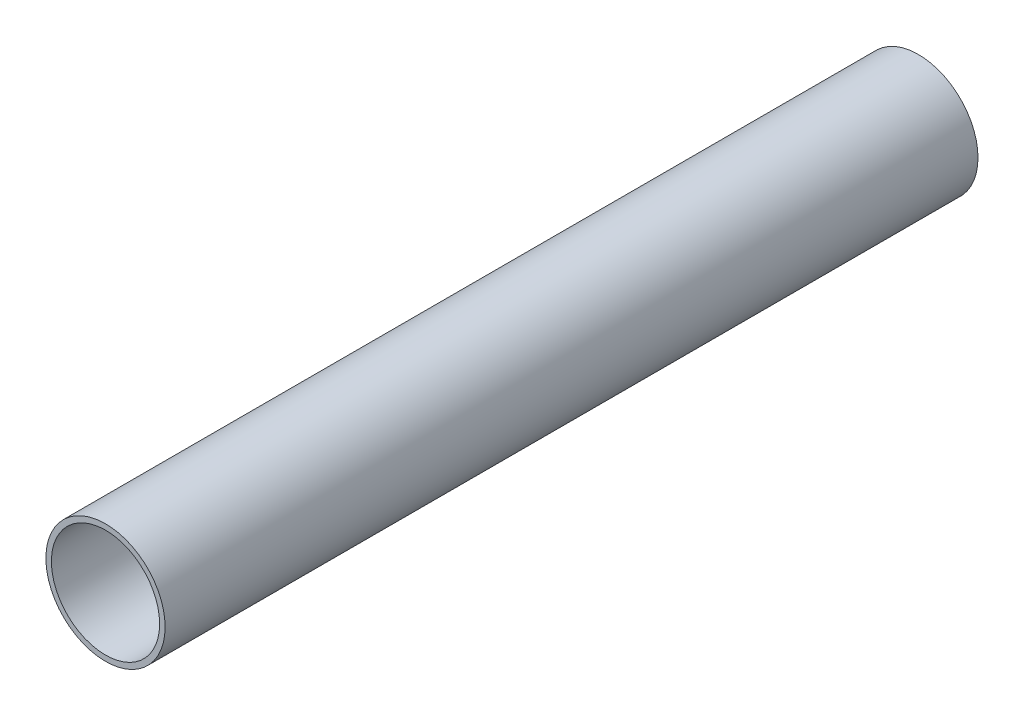
ISO-10303-21;
HEADER;
FILE_DESCRIPTION(('STEP AP214'),'2;1');
FILE_NAME('part.step','',(''),(''),'','','');
FILE_SCHEMA(('AUTOMOTIVE_DESIGN { 1 0 10303 214 1 1 1 1 }'));
ENDSEC;
DATA;
#1=APPLICATION_CONTEXT('core data for automotive mechanical design processes');
#2=APPLICATION_PROTOCOL_DEFINITION('international standard','automotive_design',2000,#1);
#3=PRODUCT_CONTEXT('',#1,'mechanical');
#4=PRODUCT('Part','Part','',(#3));
#5=PRODUCT_RELATED_PRODUCT_CATEGORY('part','',(#4));
#6=PRODUCT_DEFINITION_FORMATION('','',#4);
#7=PRODUCT_DEFINITION_CONTEXT('part definition',#1,'design');
#8=PRODUCT_DEFINITION('design','',#6,#7);
#9=PRODUCT_DEFINITION_SHAPE('','',#8);
#10=(LENGTH_UNIT() NAMED_UNIT(*) SI_UNIT(.MILLI.,.METRE.));
#11=(NAMED_UNIT(*) PLANE_ANGLE_UNIT() SI_UNIT($,.RADIAN.));
#12=(NAMED_UNIT(*) SI_UNIT($,.STERADIAN.) SOLID_ANGLE_UNIT());
#13=UNCERTAINTY_MEASURE_WITH_UNIT(LENGTH_MEASURE(1.E-05),#10,'distance_accuracy_value','');
#14=(GEOMETRIC_REPRESENTATION_CONTEXT(3) GLOBAL_UNCERTAINTY_ASSIGNED_CONTEXT((#13)) GLOBAL_UNIT_ASSIGNED_CONTEXT((#10,
#11,#12)) REPRESENTATION_CONTEXT('',''));
#15=CARTESIAN_POINT('',(0.,0.,0.));
#16=DIRECTION('',(0.,0.,1.));
#17=DIRECTION('',(1.,0.,0.));
#18=AXIS2_PLACEMENT_3D('',#15,#16,#17);
#19=CARTESIAN_POINT('',(0.140137906301864,0.,750.));
#20=DIRECTION('',(0.,0.,-1.));
#21=DIRECTION('',(-1.,0.,0.));
#22=AXIS2_PLACEMENT_3D('',#19,#20,#21);
#23=CYLINDRICAL_SURFACE('',#22,49.92);
#24=CARTESIAN_POINT('',(0.140137906301864,0.,750.));
#25=DIRECTION('',(0.,0.,1.));
#26=DIRECTION('',(1.,0.,0.));
#27=AXIS2_PLACEMENT_3D('',#24,#25,#26);
#28=CIRCLE('',#27,49.92);
#29=CARTESIAN_POINT('',(50.0601379063019,0.,750.));
#30=VERTEX_POINT('',#29);
#31=EDGE_CURVE('E38',#30,#30,#28,.T.);
#32=ORIENTED_EDGE('',*,*,#31,.T.);
#33=EDGE_LOOP('',(#32));
#34=FACE_BOUND('',#33,.T.);
#35=CARTESIAN_POINT('',(0.140137906301864,0.,0.));
#36=DIRECTION('',(0.,0.,1.));
#37=DIRECTION('',(1.,0.,0.));
#38=AXIS2_PLACEMENT_3D('',#35,#36,#37);
#39=CIRCLE('',#38,49.92);
#40=CARTESIAN_POINT('',(50.0601379063019,0.,0.));
#41=VERTEX_POINT('',#40);
#42=EDGE_CURVE('E44',#41,#41,#39,.T.);
#43=ORIENTED_EDGE('',*,*,#42,.F.);
#44=EDGE_LOOP('',(#43));
#45=FACE_BOUND('',#44,.T.);
#46=ADVANCED_FACE('F31',(#34,#45),#23,.F.);
#47=CARTESIAN_POINT('',(0.140137906301864,0.,750.));
#48=DIRECTION('',(0.,0.,-1.));
#49=DIRECTION('',(-1.,0.,0.));
#50=AXIS2_PLACEMENT_3D('',#47,#48,#49);
#51=CYLINDRICAL_SURFACE('',#50,55.);
#52=CARTESIAN_POINT('',(0.140137906301864,0.,750.));
#53=DIRECTION('',(0.,0.,1.));
#54=DIRECTION('',(1.,0.,0.));
#55=AXIS2_PLACEMENT_3D('',#52,#53,#54);
#56=CIRCLE('',#55,55.);
#57=CARTESIAN_POINT('',(55.1401379063019,0.,750.));
#58=VERTEX_POINT('',#57);
#59=EDGE_CURVE('E10',#58,#58,#56,.T.);
#60=ORIENTED_EDGE('',*,*,#59,.F.);
#61=EDGE_LOOP('',(#60));
#62=FACE_BOUND('',#61,.T.);
#63=CARTESIAN_POINT('',(0.140137906301864,0.,0.));
#64=DIRECTION('',(0.,0.,1.));
#65=DIRECTION('',(1.,0.,0.));
#66=AXIS2_PLACEMENT_3D('',#63,#64,#65);
#67=CIRCLE('',#66,55.);
#68=CARTESIAN_POINT('',(55.1401379063019,0.,0.));
#69=VERTEX_POINT('',#68);
#70=EDGE_CURVE('E34',#69,#69,#67,.T.);
#71=ORIENTED_EDGE('',*,*,#70,.T.);
#72=EDGE_LOOP('',(#71));
#73=FACE_BOUND('',#72,.T.);
#74=ADVANCED_FACE('F51',(#62,#73),#51,.T.);
#75=CARTESIAN_POINT('',(0.,0.,750.));
#76=DIRECTION('',(0.,0.,1.));
#77=DIRECTION('',(1.,0.,0.));
#78=AXIS2_PLACEMENT_3D('',#75,#76,#77);
#79=PLANE('',#78);
#80=ORIENTED_EDGE('',*,*,#31,.F.);
#81=EDGE_LOOP('',(#80));
#82=FACE_BOUND('',#81,.T.);
#83=ORIENTED_EDGE('',*,*,#59,.T.);
#84=EDGE_LOOP('',(#83));
#85=FACE_BOUND('',#84,.T.);
#86=ADVANCED_FACE('F55',(#82,#85),#79,.T.);
#87=CARTESIAN_POINT('',(0.,0.,0.));
#88=DIRECTION('',(0.,0.,1.));
#89=DIRECTION('',(1.,0.,0.));
#90=AXIS2_PLACEMENT_3D('',#87,#88,#89);
#91=PLANE('',#90);
#92=ORIENTED_EDGE('',*,*,#42,.T.);
#93=EDGE_LOOP('',(#92));
#94=FACE_BOUND('',#93,.T.);
#95=ORIENTED_EDGE('',*,*,#70,.F.);
#96=EDGE_LOOP('',(#95));
#97=FACE_BOUND('',#96,.T.);
#98=ADVANCED_FACE('F53',(#94,#97),#91,.F.);
#99=CLOSED_SHELL('',(#46,#74,#86,#98));
#100=MANIFOLD_SOLID_BREP('B2',#99);
#101=ADVANCED_BREP_SHAPE_REPRESENTATION('',(#18,#100),#14);
#102=SHAPE_DEFINITION_REPRESENTATION(#9,#101);
ENDSEC;
END-ISO-10303-21;
